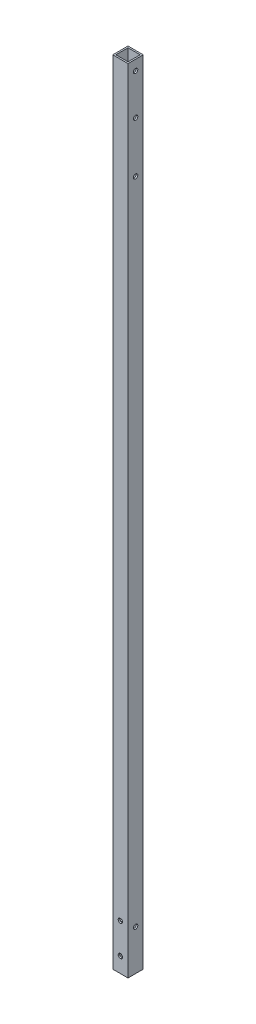
ISO-10303-21;
HEADER;
FILE_DESCRIPTION(('STEP AP214'),'2;1');
FILE_NAME('part.step','',(''),(''),'','','');
FILE_SCHEMA(('AUTOMOTIVE_DESIGN { 1 0 10303 214 1 1 1 1 }'));
ENDSEC;
DATA;
#1=APPLICATION_CONTEXT('core data for automotive mechanical design processes');
#2=APPLICATION_PROTOCOL_DEFINITION('international standard','automotive_design',2000,#1);
#3=PRODUCT_CONTEXT('',#1,'mechanical');
#4=PRODUCT('Part','Part','',(#3));
#5=PRODUCT_RELATED_PRODUCT_CATEGORY('part','',(#4));
#6=PRODUCT_DEFINITION_FORMATION('','',#4);
#7=PRODUCT_DEFINITION_CONTEXT('part definition',#1,'design');
#8=PRODUCT_DEFINITION('design','',#6,#7);
#9=PRODUCT_DEFINITION_SHAPE('','',#8);
#10=(LENGTH_UNIT() NAMED_UNIT(*) SI_UNIT(.MILLI.,.METRE.));
#11=(NAMED_UNIT(*) PLANE_ANGLE_UNIT() SI_UNIT($,.RADIAN.));
#12=(NAMED_UNIT(*) SI_UNIT($,.STERADIAN.) SOLID_ANGLE_UNIT());
#13=UNCERTAINTY_MEASURE_WITH_UNIT(LENGTH_MEASURE(1.E-05),#10,'distance_accuracy_value','');
#14=(GEOMETRIC_REPRESENTATION_CONTEXT(3) GLOBAL_UNCERTAINTY_ASSIGNED_CONTEXT((#13)) GLOBAL_UNIT_ASSIGNED_CONTEXT((#10,
#11,#12)) REPRESENTATION_CONTEXT('',''));
#15=CARTESIAN_POINT('',(0.,0.,0.));
#16=DIRECTION('',(0.,0.,1.));
#17=DIRECTION('',(1.,0.,0.));
#18=AXIS2_PLACEMENT_3D('',#15,#16,#17);
#19=CARTESIAN_POINT('',(0.,780.,0.));
#20=DIRECTION('',(0.,1.,0.));
#21=DIRECTION('',(0.,0.,1.));
#22=AXIS2_PLACEMENT_3D('',#19,#20,#21);
#23=PLANE('',#22);
#24=DIRECTION('',(0.,0.,1.));
#25=VECTOR('',#24,1.);
#26=CARTESIAN_POINT('',(0.,780.,0.));
#27=LINE('',#26,#25);
#28=CARTESIAN_POINT('',(0.,780.,-15.));
#29=VERTEX_POINT('',#28);
#30=CARTESIAN_POINT('',(0.,780.,0.));
#31=VERTEX_POINT('',#30);
#32=EDGE_CURVE('E164',#29,#31,#27,.T.);
#33=ORIENTED_EDGE('',*,*,#32,.T.);
#34=DIRECTION('',(1.,0.,0.));
#35=VECTOR('',#34,1.);
#36=CARTESIAN_POINT('',(0.,780.,0.));
#37=LINE('',#36,#35);
#38=CARTESIAN_POINT('',(15.,780.,0.));
#39=VERTEX_POINT('',#38);
#40=EDGE_CURVE('E167',#31,#39,#37,.T.);
#41=ORIENTED_EDGE('',*,*,#40,.T.);
#42=DIRECTION('',(0.,0.,-1.));
#43=VECTOR('',#42,1.);
#44=CARTESIAN_POINT('',(15.,780.,0.));
#45=LINE('',#44,#43);
#46=CARTESIAN_POINT('',(15.,780.,-15.));
#47=VERTEX_POINT('',#46);
#48=EDGE_CURVE('E170',#39,#47,#45,.T.);
#49=ORIENTED_EDGE('',*,*,#48,.T.);
#50=DIRECTION('',(-1.,0.,0.));
#51=VECTOR('',#50,1.);
#52=CARTESIAN_POINT('',(0.,780.,-15.));
#53=LINE('',#52,#51);
#54=EDGE_CURVE('E172',#47,#29,#53,.T.);
#55=ORIENTED_EDGE('',*,*,#54,.T.);
#56=EDGE_LOOP('',(#33,#41,#49,#55));
#57=FACE_BOUND('',#56,.T.);
#58=DIRECTION('',(1.,0.,0.));
#59=VECTOR('',#58,1.);
#60=CARTESIAN_POINT('',(0.,780.,-1.5));
#61=LINE('',#60,#59);
#62=CARTESIAN_POINT('',(1.5,780.,-1.5));
#63=VERTEX_POINT('',#62);
#64=CARTESIAN_POINT('',(13.5,780.,-1.5));
#65=VERTEX_POINT('',#64);
#66=EDGE_CURVE('E134',#63,#65,#61,.T.);
#67=ORIENTED_EDGE('',*,*,#66,.F.);
#68=DIRECTION('',(0.,0.,1.));
#69=VECTOR('',#68,1.);
#70=CARTESIAN_POINT('',(1.5,780.,0.));
#71=LINE('',#70,#69);
#72=CARTESIAN_POINT('',(1.5,780.,-13.5));
#73=VERTEX_POINT('',#72);
#74=EDGE_CURVE('E126',#73,#63,#71,.T.);
#75=ORIENTED_EDGE('',*,*,#74,.F.);
#76=DIRECTION('',(-1.,0.,0.));
#77=VECTOR('',#76,1.);
#78=CARTESIAN_POINT('',(0.,780.,-13.5));
#79=LINE('',#78,#77);
#80=CARTESIAN_POINT('',(13.5,780.,-13.5));
#81=VERTEX_POINT('',#80);
#82=EDGE_CURVE('E148',#81,#73,#79,.T.);
#83=ORIENTED_EDGE('',*,*,#82,.F.);
#84=DIRECTION('',(0.,0.,-1.));
#85=VECTOR('',#84,1.);
#86=CARTESIAN_POINT('',(13.5,780.,0.));
#87=LINE('',#86,#85);
#88=EDGE_CURVE('E146',#65,#81,#87,.T.);
#89=ORIENTED_EDGE('',*,*,#88,.F.);
#90=EDGE_LOOP('',(#67,#75,#83,#89));
#91=FACE_BOUND('',#90,.T.);
#92=ADVANCED_FACE('F59',(#57,#91),#23,.T.);
#93=CARTESIAN_POINT('',(0.,0.,0.));
#94=DIRECTION('',(0.,1.,0.));
#95=DIRECTION('',(0.,0.,1.));
#96=AXIS2_PLACEMENT_3D('',#93,#94,#95);
#97=PLANE('',#96);
#98=DIRECTION('',(0.,0.,1.));
#99=VECTOR('',#98,1.);
#100=CARTESIAN_POINT('',(0.,0.,0.));
#101=LINE('',#100,#99);
#102=CARTESIAN_POINT('',(0.,0.,-15.));
#103=VERTEX_POINT('',#102);
#104=CARTESIAN_POINT('',(0.,0.,0.));
#105=VERTEX_POINT('',#104);
#106=EDGE_CURVE('E142',#103,#105,#101,.T.);
#107=ORIENTED_EDGE('',*,*,#106,.F.);
#108=DIRECTION('',(-1.,0.,0.));
#109=VECTOR('',#108,1.);
#110=CARTESIAN_POINT('',(0.,0.,-15.));
#111=LINE('',#110,#109);
#112=CARTESIAN_POINT('',(15.,0.,-15.));
#113=VERTEX_POINT('',#112);
#114=EDGE_CURVE('E168',#113,#103,#111,.T.);
#115=ORIENTED_EDGE('',*,*,#114,.F.);
#116=DIRECTION('',(0.,0.,-1.));
#117=VECTOR('',#116,1.);
#118=CARTESIAN_POINT('',(15.,0.,0.));
#119=LINE('',#118,#117);
#120=CARTESIAN_POINT('',(15.,0.,0.));
#121=VERTEX_POINT('',#120);
#122=EDGE_CURVE('E179',#121,#113,#119,.T.);
#123=ORIENTED_EDGE('',*,*,#122,.F.);
#124=DIRECTION('',(1.,0.,0.));
#125=VECTOR('',#124,1.);
#126=CARTESIAN_POINT('',(0.,0.,0.));
#127=LINE('',#126,#125);
#128=EDGE_CURVE('E177',#105,#121,#127,.T.);
#129=ORIENTED_EDGE('',*,*,#128,.F.);
#130=EDGE_LOOP('',(#107,#115,#123,#129));
#131=FACE_BOUND('',#130,.T.);
#132=DIRECTION('',(0.,0.,1.));
#133=VECTOR('',#132,1.);
#134=CARTESIAN_POINT('',(1.5,0.,0.));
#135=LINE('',#134,#133);
#136=CARTESIAN_POINT('',(1.5,0.,-13.5));
#137=VERTEX_POINT('',#136);
#138=CARTESIAN_POINT('',(1.5,0.,-1.5));
#139=VERTEX_POINT('',#138);
#140=EDGE_CURVE('E84',#137,#139,#135,.T.);
#141=ORIENTED_EDGE('',*,*,#140,.T.);
#142=DIRECTION('',(1.,0.,0.));
#143=VECTOR('',#142,1.);
#144=CARTESIAN_POINT('',(0.,0.,-1.5));
#145=LINE('',#144,#143);
#146=CARTESIAN_POINT('',(13.5,0.,-1.5));
#147=VERTEX_POINT('',#146);
#148=EDGE_CURVE('E141',#139,#147,#145,.T.);
#149=ORIENTED_EDGE('',*,*,#148,.T.);
#150=DIRECTION('',(0.,0.,-1.));
#151=VECTOR('',#150,1.);
#152=CARTESIAN_POINT('',(13.5,0.,0.));
#153=LINE('',#152,#151);
#154=CARTESIAN_POINT('',(13.5,0.,-13.5));
#155=VERTEX_POINT('',#154);
#156=EDGE_CURVE('E156',#147,#155,#153,.T.);
#157=ORIENTED_EDGE('',*,*,#156,.T.);
#158=DIRECTION('',(-1.,0.,0.));
#159=VECTOR('',#158,1.);
#160=CARTESIAN_POINT('',(0.,0.,-13.5));
#161=LINE('',#160,#159);
#162=EDGE_CURVE('E135',#155,#137,#161,.T.);
#163=ORIENTED_EDGE('',*,*,#162,.T.);
#164=EDGE_LOOP('',(#141,#149,#157,#163));
#165=FACE_BOUND('',#164,.T.);
#166=ADVANCED_FACE('F285',(#131,#165),#97,.F.);
#167=CARTESIAN_POINT('',(0.,780.,0.));
#168=DIRECTION('',(1.,0.,0.));
#169=DIRECTION('',(0.,0.,-1.));
#170=AXIS2_PLACEMENT_3D('',#167,#168,#169);
#171=PLANE('',#170);
#172=CARTESIAN_POINT('',(0.,770.,-7.4999999999999));
#173=DIRECTION('',(1.,0.,0.));
#174=DIRECTION('',(0.,0.,-1.));
#175=AXIS2_PLACEMENT_3D('',#172,#173,#174);
#176=CIRCLE('',#175,2.15000000000003);
#177=CARTESIAN_POINT('',(0.,770.,-9.64999999999994));
#178=VERTEX_POINT('',#177);
#179=EDGE_CURVE('E193',#178,#178,#176,.F.);
#180=ORIENTED_EDGE('',*,*,#179,.F.);
#181=EDGE_LOOP('',(#180));
#182=FACE_BOUND('',#181,.T.);
#183=CARTESIAN_POINT('',(0.,680.,-7.49999999999992));
#184=DIRECTION('',(1.,0.,0.));
#185=DIRECTION('',(0.,0.,-1.));
#186=AXIS2_PLACEMENT_3D('',#183,#184,#185);
#187=CIRCLE('',#186,2.15000000000003);
#188=CARTESIAN_POINT('',(0.,680.,-9.64999999999995));
#189=VERTEX_POINT('',#188);
#190=EDGE_CURVE('E233',#189,#189,#187,.F.);
#191=ORIENTED_EDGE('',*,*,#190,.F.);
#192=EDGE_LOOP('',(#191));
#193=FACE_BOUND('',#192,.T.);
#194=CARTESIAN_POINT('',(0.,39.9999999999998,-7.5));
#195=DIRECTION('',(1.,0.,0.));
#196=DIRECTION('',(0.,0.,-1.));
#197=AXIS2_PLACEMENT_3D('',#194,#195,#196);
#198=CIRCLE('',#197,2.15);
#199=CARTESIAN_POINT('',(0.,39.9999999999998,-9.65));
#200=VERTEX_POINT('',#199);
#201=EDGE_CURVE('E239',#200,#200,#198,.F.);
#202=ORIENTED_EDGE('',*,*,#201,.F.);
#203=EDGE_LOOP('',(#202));
#204=FACE_BOUND('',#203,.T.);
#205=CARTESIAN_POINT('',(0.,730.,-7.50000000000001));
#206=DIRECTION('',(1.,0.,0.));
#207=DIRECTION('',(0.,0.,-1.));
#208=AXIS2_PLACEMENT_3D('',#205,#206,#207);
#209=CIRCLE('',#208,2.15000000000004);
#210=CARTESIAN_POINT('',(0.,730.,-9.65000000000004));
#211=VERTEX_POINT('',#210);
#212=EDGE_CURVE('E245',#211,#211,#209,.F.);
#213=ORIENTED_EDGE('',*,*,#212,.F.);
#214=EDGE_LOOP('',(#213));
#215=FACE_BOUND('',#214,.T.);
#216=ORIENTED_EDGE('',*,*,#106,.T.);
#217=DIRECTION('',(0.,-1.,0.));
#218=VECTOR('',#217,1.);
#219=CARTESIAN_POINT('',(0.,780.,0.));
#220=LINE('',#219,#218);
#221=EDGE_CURVE('E12',#31,#105,#220,.T.);
#222=ORIENTED_EDGE('',*,*,#221,.F.);
#223=ORIENTED_EDGE('',*,*,#32,.F.);
#224=DIRECTION('',(0.,-1.,0.));
#225=VECTOR('',#224,1.);
#226=CARTESIAN_POINT('',(0.,780.,-15.));
#227=LINE('',#226,#225);
#228=EDGE_CURVE('E174',#29,#103,#227,.T.);
#229=ORIENTED_EDGE('',*,*,#228,.T.);
#230=EDGE_LOOP('',(#216,#222,#223,#229));
#231=FACE_BOUND('',#230,.T.);
#232=ADVANCED_FACE('F61',(#182,#193,#204,#215,#231),#171,.F.);
#233=CARTESIAN_POINT('',(0.,780.,0.));
#234=DIRECTION('',(0.,0.,-1.));
#235=DIRECTION('',(-1.,0.,0.));
#236=AXIS2_PLACEMENT_3D('',#233,#234,#235);
#237=PLANE('',#236);
#238=CARTESIAN_POINT('',(7.50000000000011,15.,0.));
#239=DIRECTION('',(0.,0.,1.));
#240=DIRECTION('',(1.,0.,0.));
#241=AXIS2_PLACEMENT_3D('',#238,#239,#240);
#242=CIRCLE('',#241,2.15);
#243=CARTESIAN_POINT('',(9.65000000000011,15.,0.));
#244=VERTEX_POINT('',#243);
#245=EDGE_CURVE('E213',#244,#244,#242,.T.);
#246=ORIENTED_EDGE('',*,*,#245,.F.);
#247=EDGE_LOOP('',(#246));
#248=FACE_BOUND('',#247,.T.);
#249=CARTESIAN_POINT('',(7.50000000000011,45.,0.));
#250=DIRECTION('',(0.,0.,1.));
#251=DIRECTION('',(1.,0.,0.));
#252=AXIS2_PLACEMENT_3D('',#249,#250,#251);
#253=CIRCLE('',#252,2.15);
#254=CARTESIAN_POINT('',(9.65000000000011,45.,0.));
#255=VERTEX_POINT('',#254);
#256=EDGE_CURVE('E221',#255,#255,#253,.T.);
#257=ORIENTED_EDGE('',*,*,#256,.F.);
#258=EDGE_LOOP('',(#257));
#259=FACE_BOUND('',#258,.T.);
#260=ORIENTED_EDGE('',*,*,#128,.T.);
#261=DIRECTION('',(0.,-1.,0.));
#262=VECTOR('',#261,1.);
#263=CARTESIAN_POINT('',(15.,780.,0.));
#264=LINE('',#263,#262);
#265=EDGE_CURVE('E68',#39,#121,#264,.T.);
#266=ORIENTED_EDGE('',*,*,#265,.F.);
#267=ORIENTED_EDGE('',*,*,#40,.F.);
#268=ORIENTED_EDGE('',*,*,#221,.T.);
#269=EDGE_LOOP('',(#260,#266,#267,#268));
#270=FACE_BOUND('',#269,.T.);
#271=ADVANCED_FACE('F284',(#248,#259,#270),#237,.F.);
#272=CARTESIAN_POINT('',(15.,780.,0.));
#273=DIRECTION('',(-1.,0.,0.));
#274=DIRECTION('',(0.,0.,1.));
#275=AXIS2_PLACEMENT_3D('',#272,#273,#274);
#276=PLANE('',#275);
#277=CARTESIAN_POINT('',(15.,770.,-7.4999999999999));
#278=DIRECTION('',(1.,0.,0.));
#279=DIRECTION('',(0.,0.,-1.));
#280=AXIS2_PLACEMENT_3D('',#277,#278,#279);
#281=CIRCLE('',#280,2.15000000000003);
#282=CARTESIAN_POINT('',(15.,770.,-9.64999999999994));
#283=VERTEX_POINT('',#282);
#284=EDGE_CURVE('E230',#283,#283,#281,.T.);
#285=ORIENTED_EDGE('',*,*,#284,.F.);
#286=EDGE_LOOP('',(#285));
#287=FACE_BOUND('',#286,.T.);
#288=CARTESIAN_POINT('',(15.,680.,-7.49999999999992));
#289=DIRECTION('',(1.,0.,0.));
#290=DIRECTION('',(0.,0.,-1.));
#291=AXIS2_PLACEMENT_3D('',#288,#289,#290);
#292=CIRCLE('',#291,2.15000000000003);
#293=CARTESIAN_POINT('',(15.,680.,-9.64999999999995));
#294=VERTEX_POINT('',#293);
#295=EDGE_CURVE('E236',#294,#294,#292,.T.);
#296=ORIENTED_EDGE('',*,*,#295,.F.);
#297=EDGE_LOOP('',(#296));
#298=FACE_BOUND('',#297,.T.);
#299=CARTESIAN_POINT('',(15.,39.9999999999998,-7.5));
#300=DIRECTION('',(1.,0.,0.));
#301=DIRECTION('',(0.,0.,-1.));
#302=AXIS2_PLACEMENT_3D('',#299,#300,#301);
#303=CIRCLE('',#302,2.15);
#304=CARTESIAN_POINT('',(15.,39.9999999999998,-9.65));
#305=VERTEX_POINT('',#304);
#306=EDGE_CURVE('E242',#305,#305,#303,.T.);
#307=ORIENTED_EDGE('',*,*,#306,.F.);
#308=EDGE_LOOP('',(#307));
#309=FACE_BOUND('',#308,.T.);
#310=CARTESIAN_POINT('',(15.,730.,-7.50000000000001));
#311=DIRECTION('',(1.,0.,0.));
#312=DIRECTION('',(0.,0.,-1.));
#313=AXIS2_PLACEMENT_3D('',#310,#311,#312);
#314=CIRCLE('',#313,2.15000000000004);
#315=CARTESIAN_POINT('',(15.,730.,-9.65000000000004));
#316=VERTEX_POINT('',#315);
#317=EDGE_CURVE('E229',#316,#316,#314,.T.);
#318=ORIENTED_EDGE('',*,*,#317,.F.);
#319=EDGE_LOOP('',(#318));
#320=FACE_BOUND('',#319,.T.);
#321=ORIENTED_EDGE('',*,*,#122,.T.);
#322=DIRECTION('',(0.,-1.,0.));
#323=VECTOR('',#322,1.);
#324=CARTESIAN_POINT('',(15.,780.,-15.));
#325=LINE('',#324,#323);
#326=EDGE_CURVE('E184',#47,#113,#325,.T.);
#327=ORIENTED_EDGE('',*,*,#326,.F.);
#328=ORIENTED_EDGE('',*,*,#48,.F.);
#329=ORIENTED_EDGE('',*,*,#265,.T.);
#330=EDGE_LOOP('',(#321,#327,#328,#329));
#331=FACE_BOUND('',#330,.T.);
#332=ADVANCED_FACE('F303',(#287,#298,#309,#320,#331),#276,.F.);
#333=CARTESIAN_POINT('',(0.,780.,-15.));
#334=DIRECTION('',(0.,0.,1.));
#335=DIRECTION('',(1.,0.,0.));
#336=AXIS2_PLACEMENT_3D('',#333,#334,#335);
#337=PLANE('',#336);
#338=CARTESIAN_POINT('',(7.50000000000011,15.,-15.));
#339=DIRECTION('',(0.,0.,1.));
#340=DIRECTION('',(1.,0.,0.));
#341=AXIS2_PLACEMENT_3D('',#338,#339,#340);
#342=CIRCLE('',#341,2.15);
#343=CARTESIAN_POINT('',(9.65000000000011,15.,-15.));
#344=VERTEX_POINT('',#343);
#345=EDGE_CURVE('E207',#344,#344,#342,.F.);
#346=ORIENTED_EDGE('',*,*,#345,.F.);
#347=EDGE_LOOP('',(#346));
#348=FACE_BOUND('',#347,.T.);
#349=CARTESIAN_POINT('',(7.50000000000011,45.,-15.));
#350=DIRECTION('',(0.,0.,1.));
#351=DIRECTION('',(1.,0.,0.));
#352=AXIS2_PLACEMENT_3D('',#349,#350,#351);
#353=CIRCLE('',#352,2.15);
#354=CARTESIAN_POINT('',(9.65000000000011,45.,-15.));
#355=VERTEX_POINT('',#354);
#356=EDGE_CURVE('E218',#355,#355,#353,.F.);
#357=ORIENTED_EDGE('',*,*,#356,.F.);
#358=EDGE_LOOP('',(#357));
#359=FACE_BOUND('',#358,.T.);
#360=ORIENTED_EDGE('',*,*,#114,.T.);
#361=ORIENTED_EDGE('',*,*,#228,.F.);
#362=ORIENTED_EDGE('',*,*,#54,.F.);
#363=ORIENTED_EDGE('',*,*,#326,.T.);
#364=EDGE_LOOP('',(#360,#361,#362,#363));
#365=FACE_BOUND('',#364,.T.);
#366=ADVANCED_FACE('F265',(#348,#359,#365),#337,.F.);
#367=CARTESIAN_POINT('',(1.5,780.,0.));
#368=DIRECTION('',(1.,0.,0.));
#369=DIRECTION('',(0.,0.,-1.));
#370=AXIS2_PLACEMENT_3D('',#367,#368,#369);
#371=PLANE('',#370);
#372=CARTESIAN_POINT('',(1.5,770.,-7.4999999999999));
#373=DIRECTION('',(1.,0.,0.));
#374=DIRECTION('',(0.,0.,-1.));
#375=AXIS2_PLACEMENT_3D('',#372,#373,#374);
#376=CIRCLE('',#375,2.15000000000003);
#377=CARTESIAN_POINT('',(1.5,770.,-9.64999999999994));
#378=VERTEX_POINT('',#377);
#379=EDGE_CURVE('E154',#378,#378,#376,.T.);
#380=ORIENTED_EDGE('',*,*,#379,.F.);
#381=EDGE_LOOP('',(#380));
#382=FACE_BOUND('',#381,.T.);
#383=CARTESIAN_POINT('',(1.5,680.,-7.49999999999992));
#384=DIRECTION('',(1.,0.,0.));
#385=DIRECTION('',(0.,0.,-1.));
#386=AXIS2_PLACEMENT_3D('',#383,#384,#385);
#387=CIRCLE('',#386,2.15000000000003);
#388=CARTESIAN_POINT('',(1.5,680.,-9.64999999999995));
#389=VERTEX_POINT('',#388);
#390=EDGE_CURVE('E201',#389,#389,#387,.T.);
#391=ORIENTED_EDGE('',*,*,#390,.F.);
#392=EDGE_LOOP('',(#391));
#393=FACE_BOUND('',#392,.T.);
#394=CARTESIAN_POINT('',(1.5,39.9999999999998,-7.5));
#395=DIRECTION('',(1.,0.,0.));
#396=DIRECTION('',(0.,0.,-1.));
#397=AXIS2_PLACEMENT_3D('',#394,#395,#396);
#398=CIRCLE('',#397,2.15);
#399=CARTESIAN_POINT('',(1.5,39.9999999999998,-9.65));
#400=VERTEX_POINT('',#399);
#401=EDGE_CURVE('E197',#400,#400,#398,.T.);
#402=ORIENTED_EDGE('',*,*,#401,.F.);
#403=EDGE_LOOP('',(#402));
#404=FACE_BOUND('',#403,.T.);
#405=CARTESIAN_POINT('',(1.5,730.,-7.50000000000001));
#406=DIRECTION('',(1.,0.,0.));
#407=DIRECTION('',(0.,0.,-1.));
#408=AXIS2_PLACEMENT_3D('',#405,#406,#407);
#409=CIRCLE('',#408,2.15000000000004);
#410=CARTESIAN_POINT('',(1.5,730.,-9.65000000000004));
#411=VERTEX_POINT('',#410);
#412=EDGE_CURVE('E192',#411,#411,#409,.T.);
#413=ORIENTED_EDGE('',*,*,#412,.F.);
#414=EDGE_LOOP('',(#413));
#415=FACE_BOUND('',#414,.T.);
#416=ORIENTED_EDGE('',*,*,#140,.F.);
#417=DIRECTION('',(0.,-1.,0.));
#418=VECTOR('',#417,1.);
#419=CARTESIAN_POINT('',(1.5,780.,-13.5));
#420=LINE('',#419,#418);
#421=EDGE_CURVE('E130',#73,#137,#420,.T.);
#422=ORIENTED_EDGE('',*,*,#421,.F.);
#423=ORIENTED_EDGE('',*,*,#74,.T.);
#424=DIRECTION('',(0.,-1.,0.));
#425=VECTOR('',#424,1.);
#426=CARTESIAN_POINT('',(1.5,780.,-1.5));
#427=LINE('',#426,#425);
#428=EDGE_CURVE('E129',#63,#139,#427,.T.);
#429=ORIENTED_EDGE('',*,*,#428,.T.);
#430=EDGE_LOOP('',(#416,#422,#423,#429));
#431=FACE_BOUND('',#430,.T.);
#432=ADVANCED_FACE('F128',(#382,#393,#404,#415,#431),#371,.T.);
#433=CARTESIAN_POINT('',(0.,780.,-1.5));
#434=DIRECTION('',(0.,0.,-1.));
#435=DIRECTION('',(-1.,0.,0.));
#436=AXIS2_PLACEMENT_3D('',#433,#434,#435);
#437=PLANE('',#436);
#438=CARTESIAN_POINT('',(7.50000000000011,15.,-1.5));
#439=DIRECTION('',(0.,0.,-1.));
#440=DIRECTION('',(-1.,0.,0.));
#441=AXIS2_PLACEMENT_3D('',#438,#439,#440);
#442=CIRCLE('',#441,2.15);
#443=CARTESIAN_POINT('',(5.35000000000011,15.,-1.5));
#444=VERTEX_POINT('',#443);
#445=EDGE_CURVE('E226',#444,#444,#442,.T.);
#446=ORIENTED_EDGE('',*,*,#445,.F.);
#447=EDGE_LOOP('',(#446));
#448=FACE_BOUND('',#447,.T.);
#449=CARTESIAN_POINT('',(7.50000000000011,45.,-1.5));
#450=DIRECTION('',(0.,0.,-1.));
#451=DIRECTION('',(-1.,0.,0.));
#452=AXIS2_PLACEMENT_3D('',#449,#450,#451);
#453=CIRCLE('',#452,2.15);
#454=CARTESIAN_POINT('',(5.35000000000011,45.,-1.5));
#455=VERTEX_POINT('',#454);
#456=EDGE_CURVE('E206',#455,#455,#453,.T.);
#457=ORIENTED_EDGE('',*,*,#456,.F.);
#458=EDGE_LOOP('',(#457));
#459=FACE_BOUND('',#458,.T.);
#460=ORIENTED_EDGE('',*,*,#148,.F.);
#461=ORIENTED_EDGE('',*,*,#428,.F.);
#462=ORIENTED_EDGE('',*,*,#66,.T.);
#463=DIRECTION('',(0.,-1.,0.));
#464=VECTOR('',#463,1.);
#465=CARTESIAN_POINT('',(13.5,780.,-1.5));
#466=LINE('',#465,#464);
#467=EDGE_CURVE('E143',#65,#147,#466,.T.);
#468=ORIENTED_EDGE('',*,*,#467,.T.);
#469=EDGE_LOOP('',(#460,#461,#462,#468));
#470=FACE_BOUND('',#469,.T.);
#471=ADVANCED_FACE('F138',(#448,#459,#470),#437,.T.);
#472=CARTESIAN_POINT('',(13.5,780.,0.));
#473=DIRECTION('',(-1.,0.,0.));
#474=DIRECTION('',(0.,0.,1.));
#475=AXIS2_PLACEMENT_3D('',#472,#473,#474);
#476=PLANE('',#475);
#477=CARTESIAN_POINT('',(13.5,770.,-7.4999999999999));
#478=DIRECTION('',(-1.,0.,0.));
#479=DIRECTION('',(0.,0.,1.));
#480=AXIS2_PLACEMENT_3D('',#477,#478,#479);
#481=CIRCLE('',#480,2.15000000000003);
#482=CARTESIAN_POINT('',(13.5,770.,-5.34999999999987));
#483=VERTEX_POINT('',#482);
#484=EDGE_CURVE('E202',#483,#483,#481,.T.);
#485=ORIENTED_EDGE('',*,*,#484,.F.);
#486=EDGE_LOOP('',(#485));
#487=FACE_BOUND('',#486,.T.);
#488=CARTESIAN_POINT('',(13.5,680.,-7.49999999999992));
#489=DIRECTION('',(-1.,0.,0.));
#490=DIRECTION('',(0.,0.,1.));
#491=AXIS2_PLACEMENT_3D('',#488,#489,#490);
#492=CIRCLE('',#491,2.15000000000003);
#493=CARTESIAN_POINT('',(13.5,680.,-5.34999999999989));
#494=VERTEX_POINT('',#493);
#495=EDGE_CURVE('E198',#494,#494,#492,.T.);
#496=ORIENTED_EDGE('',*,*,#495,.F.);
#497=EDGE_LOOP('',(#496));
#498=FACE_BOUND('',#497,.T.);
#499=CARTESIAN_POINT('',(13.5,39.9999999999998,-7.5));
#500=DIRECTION('',(-1.,0.,0.));
#501=DIRECTION('',(0.,0.,1.));
#502=AXIS2_PLACEMENT_3D('',#499,#500,#501);
#503=CIRCLE('',#502,2.15);
#504=CARTESIAN_POINT('',(13.5,39.9999999999998,-5.34999999999999));
#505=VERTEX_POINT('',#504);
#506=EDGE_CURVE('E194',#505,#505,#503,.T.);
#507=ORIENTED_EDGE('',*,*,#506,.F.);
#508=EDGE_LOOP('',(#507));
#509=FACE_BOUND('',#508,.T.);
#510=CARTESIAN_POINT('',(13.5,730.,-7.50000000000001));
#511=DIRECTION('',(-1.,0.,0.));
#512=DIRECTION('',(0.,0.,1.));
#513=AXIS2_PLACEMENT_3D('',#510,#511,#512);
#514=CIRCLE('',#513,2.15000000000004);
#515=CARTESIAN_POINT('',(13.5,730.,-5.34999999999997));
#516=VERTEX_POINT('',#515);
#517=EDGE_CURVE('E189',#516,#516,#514,.T.);
#518=ORIENTED_EDGE('',*,*,#517,.F.);
#519=EDGE_LOOP('',(#518));
#520=FACE_BOUND('',#519,.T.);
#521=ORIENTED_EDGE('',*,*,#156,.F.);
#522=ORIENTED_EDGE('',*,*,#467,.F.);
#523=ORIENTED_EDGE('',*,*,#88,.T.);
#524=DIRECTION('',(0.,-1.,0.));
#525=VECTOR('',#524,1.);
#526=CARTESIAN_POINT('',(13.5,780.,-13.5));
#527=LINE('',#526,#525);
#528=EDGE_CURVE('E76',#81,#155,#527,.T.);
#529=ORIENTED_EDGE('',*,*,#528,.T.);
#530=EDGE_LOOP('',(#521,#522,#523,#529));
#531=FACE_BOUND('',#530,.T.);
#532=ADVANCED_FACE('F325',(#487,#498,#509,#520,#531),#476,.T.);
#533=CARTESIAN_POINT('',(0.,780.,-13.5));
#534=DIRECTION('',(0.,0.,1.));
#535=DIRECTION('',(1.,0.,0.));
#536=AXIS2_PLACEMENT_3D('',#533,#534,#535);
#537=PLANE('',#536);
#538=CARTESIAN_POINT('',(7.50000000000011,15.,-13.5));
#539=DIRECTION('',(0.,0.,1.));
#540=DIRECTION('',(1.,0.,0.));
#541=AXIS2_PLACEMENT_3D('',#538,#539,#540);
#542=CIRCLE('',#541,2.15);
#543=CARTESIAN_POINT('',(9.65000000000011,15.,-13.5));
#544=VERTEX_POINT('',#543);
#545=EDGE_CURVE('E63',#544,#544,#542,.T.);
#546=ORIENTED_EDGE('',*,*,#545,.F.);
#547=EDGE_LOOP('',(#546));
#548=FACE_BOUND('',#547,.T.);
#549=CARTESIAN_POINT('',(7.50000000000011,45.,-13.5));
#550=DIRECTION('',(0.,0.,1.));
#551=DIRECTION('',(1.,0.,0.));
#552=AXIS2_PLACEMENT_3D('',#549,#550,#551);
#553=CIRCLE('',#552,2.15);
#554=CARTESIAN_POINT('',(9.65000000000011,45.,-13.5));
#555=VERTEX_POINT('',#554);
#556=EDGE_CURVE('E204',#555,#555,#553,.T.);
#557=ORIENTED_EDGE('',*,*,#556,.F.);
#558=EDGE_LOOP('',(#557));
#559=FACE_BOUND('',#558,.T.);
#560=ORIENTED_EDGE('',*,*,#162,.F.);
#561=ORIENTED_EDGE('',*,*,#528,.F.);
#562=ORIENTED_EDGE('',*,*,#82,.T.);
#563=ORIENTED_EDGE('',*,*,#421,.T.);
#564=EDGE_LOOP('',(#560,#561,#562,#563));
#565=FACE_BOUND('',#564,.T.);
#566=ADVANCED_FACE('F329',(#548,#559,#565),#537,.T.);
#567=CARTESIAN_POINT('',(-6.08111831820433,730.,-7.50000000000001));
#568=DIRECTION('',(1.,0.,0.));
#569=DIRECTION('',(0.,0.,-1.));
#570=AXIS2_PLACEMENT_3D('',#567,#568,#569);
#571=CYLINDRICAL_SURFACE('',#570,2.15000000000004);
#572=ORIENTED_EDGE('',*,*,#517,.T.);
#573=EDGE_LOOP('',(#572));
#574=FACE_BOUND('',#573,.T.);
#575=ORIENTED_EDGE('',*,*,#317,.T.);
#576=EDGE_LOOP('',(#575));
#577=FACE_BOUND('',#576,.T.);
#578=ADVANCED_FACE('F279',(#574,#577),#571,.F.);
#579=CARTESIAN_POINT('',(-6.08111831820433,39.9999999999998,-7.5));
#580=DIRECTION('',(1.,0.,0.));
#581=DIRECTION('',(0.,0.,-1.));
#582=AXIS2_PLACEMENT_3D('',#579,#580,#581);
#583=CYLINDRICAL_SURFACE('',#582,2.15);
#584=ORIENTED_EDGE('',*,*,#506,.T.);
#585=EDGE_LOOP('',(#584));
#586=FACE_BOUND('',#585,.T.);
#587=ORIENTED_EDGE('',*,*,#306,.T.);
#588=EDGE_LOOP('',(#587));
#589=FACE_BOUND('',#588,.T.);
#590=ADVANCED_FACE('F335',(#586,#589),#583,.F.);
#591=CARTESIAN_POINT('',(-6.08111831820433,680.,-7.49999999999992));
#592=DIRECTION('',(1.,0.,0.));
#593=DIRECTION('',(0.,0.,-1.));
#594=AXIS2_PLACEMENT_3D('',#591,#592,#593);
#595=CYLINDRICAL_SURFACE('',#594,2.15000000000003);
#596=ORIENTED_EDGE('',*,*,#495,.T.);
#597=EDGE_LOOP('',(#596));
#598=FACE_BOUND('',#597,.T.);
#599=ORIENTED_EDGE('',*,*,#295,.T.);
#600=EDGE_LOOP('',(#599));
#601=FACE_BOUND('',#600,.T.);
#602=ADVANCED_FACE('F339',(#598,#601),#595,.F.);
#603=CARTESIAN_POINT('',(-6.08111831820433,770.,-7.4999999999999));
#604=DIRECTION('',(1.,0.,0.));
#605=DIRECTION('',(0.,0.,-1.));
#606=AXIS2_PLACEMENT_3D('',#603,#604,#605);
#607=CYLINDRICAL_SURFACE('',#606,2.15000000000003);
#608=ORIENTED_EDGE('',*,*,#484,.T.);
#609=EDGE_LOOP('',(#608));
#610=FACE_BOUND('',#609,.T.);
#611=ORIENTED_EDGE('',*,*,#284,.T.);
#612=EDGE_LOOP('',(#611));
#613=FACE_BOUND('',#612,.T.);
#614=ADVANCED_FACE('F277',(#610,#613),#607,.F.);
#615=ORIENTED_EDGE('',*,*,#412,.T.);
#616=EDGE_LOOP('',(#615));
#617=FACE_BOUND('',#616,.T.);
#618=ORIENTED_EDGE('',*,*,#212,.T.);
#619=EDGE_LOOP('',(#618));
#620=FACE_BOUND('',#619,.T.);
#621=ADVANCED_FACE('F273',(#617,#620),#571,.F.);
#622=ORIENTED_EDGE('',*,*,#401,.T.);
#623=EDGE_LOOP('',(#622));
#624=FACE_BOUND('',#623,.T.);
#625=ORIENTED_EDGE('',*,*,#201,.T.);
#626=EDGE_LOOP('',(#625));
#627=FACE_BOUND('',#626,.T.);
#628=ADVANCED_FACE('F276',(#624,#627),#583,.F.);
#629=ORIENTED_EDGE('',*,*,#390,.T.);
#630=EDGE_LOOP('',(#629));
#631=FACE_BOUND('',#630,.T.);
#632=ORIENTED_EDGE('',*,*,#190,.T.);
#633=EDGE_LOOP('',(#632));
#634=FACE_BOUND('',#633,.T.);
#635=ADVANCED_FACE('F344',(#631,#634),#595,.F.);
#636=ORIENTED_EDGE('',*,*,#379,.T.);
#637=EDGE_LOOP('',(#636));
#638=FACE_BOUND('',#637,.T.);
#639=ORIENTED_EDGE('',*,*,#179,.T.);
#640=EDGE_LOOP('',(#639));
#641=FACE_BOUND('',#640,.T.);
#642=ADVANCED_FACE('F260',(#638,#641),#607,.F.);
#643=CARTESIAN_POINT('',(7.50000000000011,45.,-21.0811183182043));
#644=DIRECTION('',(0.,0.,1.));
#645=DIRECTION('',(1.,0.,0.));
#646=AXIS2_PLACEMENT_3D('',#643,#644,#645);
#647=CYLINDRICAL_SURFACE('',#646,2.15);
#648=ORIENTED_EDGE('',*,*,#556,.T.);
#649=EDGE_LOOP('',(#648));
#650=FACE_BOUND('',#649,.T.);
#651=ORIENTED_EDGE('',*,*,#356,.T.);
#652=EDGE_LOOP('',(#651));
#653=FACE_BOUND('',#652,.T.);
#654=ADVANCED_FACE('F348',(#650,#653),#647,.F.);
#655=CARTESIAN_POINT('',(7.50000000000011,15.,-21.0811183182043));
#656=DIRECTION('',(0.,0.,1.));
#657=DIRECTION('',(1.,0.,0.));
#658=AXIS2_PLACEMENT_3D('',#655,#656,#657);
#659=CYLINDRICAL_SURFACE('',#658,2.15);
#660=ORIENTED_EDGE('',*,*,#545,.T.);
#661=EDGE_LOOP('',(#660));
#662=FACE_BOUND('',#661,.T.);
#663=ORIENTED_EDGE('',*,*,#345,.T.);
#664=EDGE_LOOP('',(#663));
#665=FACE_BOUND('',#664,.T.);
#666=ADVANCED_FACE('F351',(#662,#665),#659,.F.);
#667=ORIENTED_EDGE('',*,*,#456,.T.);
#668=EDGE_LOOP('',(#667));
#669=FACE_BOUND('',#668,.T.);
#670=ORIENTED_EDGE('',*,*,#256,.T.);
#671=EDGE_LOOP('',(#670));
#672=FACE_BOUND('',#671,.T.);
#673=ADVANCED_FACE('F352',(#669,#672),#647,.F.);
#674=ORIENTED_EDGE('',*,*,#445,.T.);
#675=EDGE_LOOP('',(#674));
#676=FACE_BOUND('',#675,.T.);
#677=ORIENTED_EDGE('',*,*,#245,.T.);
#678=EDGE_LOOP('',(#677));
#679=FACE_BOUND('',#678,.T.);
#680=ADVANCED_FACE('F355',(#676,#679),#659,.F.);
#681=CLOSED_SHELL('',(#92,#166,#232,#271,#332,#366,#432,#471,#532,#566,#578,#590,#602,#614,#621,
#628,#635,#642,#654,#666,#673,#680));
#682=MANIFOLD_SOLID_BREP('B2',#681);
#683=ADVANCED_BREP_SHAPE_REPRESENTATION('',(#18,#682),#14);
#684=SHAPE_DEFINITION_REPRESENTATION(#9,#683);
ENDSEC;
END-ISO-10303-21;
